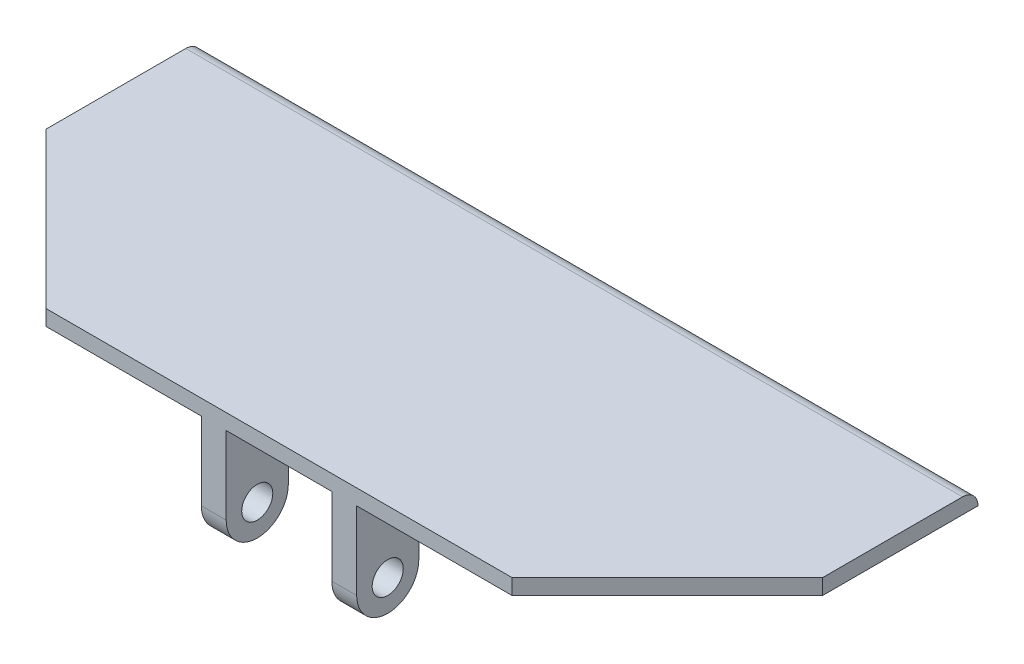
ISO-10303-21;
HEADER;
FILE_DESCRIPTION(('STEP AP214'),'2;1');
FILE_NAME('part.step','',(''),(''),'','','');
FILE_SCHEMA(('AUTOMOTIVE_DESIGN { 1 0 10303 214 1 1 1 1 }'));
ENDSEC;
DATA;
#1=APPLICATION_CONTEXT('core data for automotive mechanical design processes');
#2=APPLICATION_PROTOCOL_DEFINITION('international standard','automotive_design',2000,#1);
#3=PRODUCT_CONTEXT('',#1,'mechanical');
#4=PRODUCT('Part','Part','',(#3));
#5=PRODUCT_RELATED_PRODUCT_CATEGORY('part','',(#4));
#6=PRODUCT_DEFINITION_FORMATION('','',#4);
#7=PRODUCT_DEFINITION_CONTEXT('part definition',#1,'design');
#8=PRODUCT_DEFINITION('design','',#6,#7);
#9=PRODUCT_DEFINITION_SHAPE('','',#8);
#10=(LENGTH_UNIT() NAMED_UNIT(*) SI_UNIT(.MILLI.,.METRE.));
#11=(NAMED_UNIT(*) PLANE_ANGLE_UNIT() SI_UNIT($,.RADIAN.));
#12=(NAMED_UNIT(*) SI_UNIT($,.STERADIAN.) SOLID_ANGLE_UNIT());
#13=UNCERTAINTY_MEASURE_WITH_UNIT(LENGTH_MEASURE(1.E-05),#10,'distance_accuracy_value','');
#14=(GEOMETRIC_REPRESENTATION_CONTEXT(3) GLOBAL_UNCERTAINTY_ASSIGNED_CONTEXT((#13)) GLOBAL_UNIT_ASSIGNED_CONTEXT((#10,
#11,#12)) REPRESENTATION_CONTEXT('',''));
#15=CARTESIAN_POINT('',(0.,0.,0.));
#16=DIRECTION('',(0.,0.,1.));
#17=DIRECTION('',(1.,0.,0.));
#18=AXIS2_PLACEMENT_3D('',#15,#16,#17);
#19=CARTESIAN_POINT('',(0.,0.,0.));
#20=DIRECTION('',(0.,1.,0.));
#21=DIRECTION('',(0.,0.,1.));
#22=AXIS2_PLACEMENT_3D('',#19,#20,#21);
#23=PLANE('',#22);
#24=DIRECTION('',(0.,0.,-1.));
#25=VECTOR('',#24,1.);
#26=CARTESIAN_POINT('',(-150.,0.,0.));
#27=LINE('',#26,#25);
#28=CARTESIAN_POINT('',(-150.,0.,0.));
#29=VERTEX_POINT('',#28);
#30=CARTESIAN_POINT('',(-150.,0.,-20.));
#31=VERTEX_POINT('',#30);
#32=EDGE_CURVE('E189',#29,#31,#27,.T.);
#33=ORIENTED_EDGE('',*,*,#32,.F.);
#34=DIRECTION('',(1.,0.,0.));
#35=VECTOR('',#34,1.);
#36=CARTESIAN_POINT('',(0.,0.,0.));
#37=LINE('',#36,#35);
#38=CARTESIAN_POINT('',(-200.,0.,0.));
#39=VERTEX_POINT('',#38);
#40=EDGE_CURVE('E232',#39,#29,#37,.T.);
#41=ORIENTED_EDGE('',*,*,#40,.F.);
#42=DIRECTION('',(0.707106781186546,0.,0.707106781186549));
#43=VECTOR('',#42,1.);
#44=CARTESIAN_POINT('',(-200.,0.,0.));
#45=LINE('',#44,#43);
#46=CARTESIAN_POINT('',(-250.,0.,-50.0000000000002));
#47=VERTEX_POINT('',#46);
#48=EDGE_CURVE('E264',#39,#47,#45,.F.);
#49=ORIENTED_EDGE('',*,*,#48,.T.);
#50=DIRECTION('',(0.,0.,1.));
#51=VECTOR('',#50,1.);
#52=CARTESIAN_POINT('',(-250.,0.,0.));
#53=LINE('',#52,#51);
#54=CARTESIAN_POINT('',(-250.,0.,-100.));
#55=VERTEX_POINT('',#54);
#56=EDGE_CURVE('E246',#55,#47,#53,.T.);
#57=ORIENTED_EDGE('',*,*,#56,.F.);
#58=DIRECTION('',(-1.,0.,0.));
#59=VECTOR('',#58,1.);
#60=CARTESIAN_POINT('',(0.,0.,-100.));
#61=LINE('',#60,#59);
#62=CARTESIAN_POINT('',(0.,0.,-100.));
#63=VERTEX_POINT('',#62);
#64=EDGE_CURVE('E242',#63,#55,#61,.T.);
#65=ORIENTED_EDGE('',*,*,#64,.F.);
#66=DIRECTION('',(0.,0.,-1.));
#67=VECTOR('',#66,1.);
#68=CARTESIAN_POINT('',(0.,0.,0.));
#69=LINE('',#68,#67);
#70=CARTESIAN_POINT('',(0.,0.,-50.));
#71=VERTEX_POINT('',#70);
#72=EDGE_CURVE('E202',#71,#63,#69,.T.);
#73=ORIENTED_EDGE('',*,*,#72,.F.);
#74=DIRECTION('',(0.707106781186549,0.,-0.707106781186546));
#75=VECTOR('',#74,1.);
#76=CARTESIAN_POINT('',(0.,0.,-50.));
#77=LINE('',#76,#75);
#78=CARTESIAN_POINT('',(-50.0000000000001,0.,0.));
#79=VERTEX_POINT('',#78);
#80=EDGE_CURVE('E260',#71,#79,#77,.F.);
#81=ORIENTED_EDGE('',*,*,#80,.T.);
#82=CARTESIAN_POINT('',(-100.,0.,0.));
#83=VERTEX_POINT('',#82);
#84=EDGE_CURVE('E250',#83,#79,#37,.T.);
#85=ORIENTED_EDGE('',*,*,#84,.F.);
#86=DIRECTION('',(0.,0.,1.));
#87=VECTOR('',#86,1.);
#88=CARTESIAN_POINT('',(-100.,0.,0.));
#89=LINE('',#88,#87);
#90=CARTESIAN_POINT('',(-100.,0.,-20.));
#91=VERTEX_POINT('',#90);
#92=EDGE_CURVE('E216',#91,#83,#89,.T.);
#93=ORIENTED_EDGE('',*,*,#92,.F.);
#94=DIRECTION('',(1.,0.,0.));
#95=VECTOR('',#94,1.);
#96=CARTESIAN_POINT('',(-108.,0.,-20.));
#97=LINE('',#96,#95);
#98=CARTESIAN_POINT('',(-108.,0.,-20.));
#99=VERTEX_POINT('',#98);
#100=EDGE_CURVE('E220',#99,#91,#97,.T.);
#101=ORIENTED_EDGE('',*,*,#100,.F.);
#102=DIRECTION('',(0.,0.,-1.));
#103=VECTOR('',#102,1.);
#104=CARTESIAN_POINT('',(-108.,0.,0.));
#105=LINE('',#104,#103);
#106=CARTESIAN_POINT('',(-108.,0.,0.));
#107=VERTEX_POINT('',#106);
#108=EDGE_CURVE('E192',#107,#99,#105,.T.);
#109=ORIENTED_EDGE('',*,*,#108,.F.);
#110=CARTESIAN_POINT('',(-142.,0.,0.));
#111=VERTEX_POINT('',#110);
#112=EDGE_CURVE('E183',#111,#107,#37,.T.);
#113=ORIENTED_EDGE('',*,*,#112,.F.);
#114=DIRECTION('',(0.,0.,1.));
#115=VECTOR('',#114,1.);
#116=CARTESIAN_POINT('',(-142.,0.,0.));
#117=LINE('',#116,#115);
#118=CARTESIAN_POINT('',(-142.,0.,-20.));
#119=VERTEX_POINT('',#118);
#120=EDGE_CURVE('E164',#119,#111,#117,.T.);
#121=ORIENTED_EDGE('',*,*,#120,.F.);
#122=DIRECTION('',(1.,0.,0.));
#123=VECTOR('',#122,1.);
#124=CARTESIAN_POINT('',(-150.,0.,-20.));
#125=LINE('',#124,#123);
#126=EDGE_CURVE('E179',#31,#119,#125,.T.);
#127=ORIENTED_EDGE('',*,*,#126,.F.);
#128=EDGE_LOOP('',(#33,#41,#49,#57,#65,#73,#81,#85,#93,#101,#109,#113,#121,#127));
#129=FACE_BOUND('',#128,.T.);
#130=ADVANCED_FACE('F47',(#129),#23,.F.);
#131=CARTESIAN_POINT('',(0.,5.,0.));
#132=DIRECTION('',(-1.,0.,0.));
#133=DIRECTION('',(0.,0.,1.));
#134=AXIS2_PLACEMENT_3D('',#131,#132,#133);
#135=PLANE('',#134);
#136=ORIENTED_EDGE('',*,*,#72,.T.);
#137=CARTESIAN_POINT('',(0.,0.,-95.));
#138=DIRECTION('',(-1.,0.,0.));
#139=DIRECTION('',(0.,0.,1.));
#140=AXIS2_PLACEMENT_3D('',#137,#138,#139);
#141=CIRCLE('',#140,5.);
#142=CARTESIAN_POINT('',(0.,5.,-95.));
#143=VERTEX_POINT('',#142);
#144=EDGE_CURVE('E288',#63,#143,#141,.F.);
#145=ORIENTED_EDGE('',*,*,#144,.T.);
#146=DIRECTION('',(0.,0.,-1.));
#147=VECTOR('',#146,1.);
#148=CARTESIAN_POINT('',(0.,5.,0.));
#149=LINE('',#148,#147);
#150=CARTESIAN_POINT('',(0.,5.,-50.));
#151=VERTEX_POINT('',#150);
#152=EDGE_CURVE('E227',#151,#143,#149,.T.);
#153=ORIENTED_EDGE('',*,*,#152,.F.);
#154=DIRECTION('',(0.,-1.,0.));
#155=VECTOR('',#154,1.);
#156=CARTESIAN_POINT('',(0.,5.,-50.));
#157=LINE('',#156,#155);
#158=EDGE_CURVE('E277',#151,#71,#157,.T.);
#159=ORIENTED_EDGE('',*,*,#158,.T.);
#160=EDGE_LOOP('',(#136,#145,#153,#159));
#161=FACE_BOUND('',#160,.T.);
#162=ADVANCED_FACE('F369',(#161),#135,.F.);
#163=CARTESIAN_POINT('',(-250.,5.,0.));
#164=DIRECTION('',(1.,0.,0.));
#165=DIRECTION('',(0.,0.,-1.));
#166=AXIS2_PLACEMENT_3D('',#163,#164,#165);
#167=PLANE('',#166);
#168=DIRECTION('',(0.,0.,1.));
#169=VECTOR('',#168,1.);
#170=CARTESIAN_POINT('',(-250.,5.,0.));
#171=LINE('',#170,#169);
#172=CARTESIAN_POINT('',(-250.,5.,-95.));
#173=VERTEX_POINT('',#172);
#174=CARTESIAN_POINT('',(-250.,5.,-50.0000000000002));
#175=VERTEX_POINT('',#174);
#176=EDGE_CURVE('E231',#173,#175,#171,.T.);
#177=ORIENTED_EDGE('',*,*,#176,.F.);
#178=CARTESIAN_POINT('',(-250.,0.,-95.));
#179=DIRECTION('',(1.,0.,0.));
#180=DIRECTION('',(0.,0.,-1.));
#181=AXIS2_PLACEMENT_3D('',#178,#179,#180);
#182=CIRCLE('',#181,5.);
#183=EDGE_CURVE('E285',#173,#55,#182,.F.);
#184=ORIENTED_EDGE('',*,*,#183,.T.);
#185=ORIENTED_EDGE('',*,*,#56,.T.);
#186=DIRECTION('',(0.,1.,0.));
#187=VECTOR('',#186,1.);
#188=CARTESIAN_POINT('',(-250.,5.,-50.0000000000002));
#189=LINE('',#188,#187);
#190=EDGE_CURVE('E267',#47,#175,#189,.T.);
#191=ORIENTED_EDGE('',*,*,#190,.T.);
#192=EDGE_LOOP('',(#177,#184,#185,#191));
#193=FACE_BOUND('',#192,.T.);
#194=ADVANCED_FACE('F354',(#193),#167,.F.);
#195=CARTESIAN_POINT('',(0.,5.,0.));
#196=DIRECTION('',(0.,0.,-1.));
#197=DIRECTION('',(-1.,0.,0.));
#198=AXIS2_PLACEMENT_3D('',#195,#196,#197);
#199=PLANE('',#198);
#200=DIRECTION('',(0.,1.,0.));
#201=VECTOR('',#200,1.);
#202=CARTESIAN_POINT('',(-150.,-35.,0.));
#203=LINE('',#202,#201);
#204=CARTESIAN_POINT('',(-150.,-25.,0.));
#205=VERTEX_POINT('',#204);
#206=EDGE_CURVE('E185',#205,#29,#203,.T.);
#207=ORIENTED_EDGE('',*,*,#206,.F.);
#208=DIRECTION('',(-1.,0.,0.));
#209=VECTOR('',#208,1.);
#210=CARTESIAN_POINT('',(-142.,-25.,0.));
#211=LINE('',#210,#209);
#212=CARTESIAN_POINT('',(-142.,-25.,0.));
#213=VERTEX_POINT('',#212);
#214=EDGE_CURVE('E11',#205,#213,#211,.F.);
#215=ORIENTED_EDGE('',*,*,#214,.T.);
#216=DIRECTION('',(0.,1.,0.));
#217=VECTOR('',#216,1.);
#218=CARTESIAN_POINT('',(-142.,-35.,0.));
#219=LINE('',#218,#217);
#220=EDGE_CURVE('E173',#213,#111,#219,.T.);
#221=ORIENTED_EDGE('',*,*,#220,.T.);
#222=ORIENTED_EDGE('',*,*,#112,.T.);
#223=DIRECTION('',(0.,1.,0.));
#224=VECTOR('',#223,1.);
#225=CARTESIAN_POINT('',(-108.,-35.,0.));
#226=LINE('',#225,#224);
#227=CARTESIAN_POINT('',(-108.,-25.,0.));
#228=VERTEX_POINT('',#227);
#229=EDGE_CURVE('E213',#228,#107,#226,.T.);
#230=ORIENTED_EDGE('',*,*,#229,.F.);
#231=DIRECTION('',(-1.,0.,0.));
#232=VECTOR('',#231,1.);
#233=CARTESIAN_POINT('',(-100.,-25.,0.));
#234=LINE('',#233,#232);
#235=CARTESIAN_POINT('',(-100.,-25.,0.));
#236=VERTEX_POINT('',#235);
#237=EDGE_CURVE('E57',#228,#236,#234,.F.);
#238=ORIENTED_EDGE('',*,*,#237,.T.);
#239=DIRECTION('',(0.,1.,0.));
#240=VECTOR('',#239,1.);
#241=CARTESIAN_POINT('',(-100.,-35.,0.));
#242=LINE('',#241,#240);
#243=EDGE_CURVE('E210',#236,#83,#242,.T.);
#244=ORIENTED_EDGE('',*,*,#243,.T.);
#245=ORIENTED_EDGE('',*,*,#84,.T.);
#246=DIRECTION('',(0.,1.,0.));
#247=VECTOR('',#246,1.);
#248=CARTESIAN_POINT('',(-50.0000000000001,5.,0.));
#249=LINE('',#248,#247);
#250=CARTESIAN_POINT('',(-50.0000000000001,5.,0.));
#251=VERTEX_POINT('',#250);
#252=EDGE_CURVE('E239',#79,#251,#249,.T.);
#253=ORIENTED_EDGE('',*,*,#252,.T.);
#254=DIRECTION('',(1.,0.,0.));
#255=VECTOR('',#254,1.);
#256=CARTESIAN_POINT('',(0.,5.,0.));
#257=LINE('',#256,#255);
#258=CARTESIAN_POINT('',(-200.,5.,0.));
#259=VERTEX_POINT('',#258);
#260=EDGE_CURVE('E235',#259,#251,#257,.T.);
#261=ORIENTED_EDGE('',*,*,#260,.F.);
#262=DIRECTION('',(0.,-1.,0.));
#263=VECTOR('',#262,1.);
#264=CARTESIAN_POINT('',(-200.,5.,0.));
#265=LINE('',#264,#263);
#266=EDGE_CURVE('E256',#259,#39,#265,.T.);
#267=ORIENTED_EDGE('',*,*,#266,.T.);
#268=ORIENTED_EDGE('',*,*,#40,.T.);
#269=EDGE_LOOP('',(#207,#215,#221,#222,#230,#238,#244,#245,#253,#261,#267,#268));
#270=FACE_BOUND('',#269,.T.);
#271=ADVANCED_FACE('F344',(#270),#199,.F.);
#272=CARTESIAN_POINT('',(0.,5.,0.));
#273=DIRECTION('',(0.,1.,0.));
#274=DIRECTION('',(0.,0.,1.));
#275=AXIS2_PLACEMENT_3D('',#272,#273,#274);
#276=PLANE('',#275);
#277=ORIENTED_EDGE('',*,*,#152,.T.);
#278=DIRECTION('',(-1.,0.,0.));
#279=VECTOR('',#278,1.);
#280=CARTESIAN_POINT('',(-250.,5.,-95.));
#281=LINE('',#280,#279);
#282=EDGE_CURVE('E281',#143,#173,#281,.T.);
#283=ORIENTED_EDGE('',*,*,#282,.T.);
#284=ORIENTED_EDGE('',*,*,#176,.T.);
#285=DIRECTION('',(-0.707106781186546,0.,-0.707106781186549));
#286=VECTOR('',#285,1.);
#287=CARTESIAN_POINT('',(-100.,5.,100.));
#288=LINE('',#287,#286);
#289=EDGE_CURVE('E274',#175,#259,#288,.F.);
#290=ORIENTED_EDGE('',*,*,#289,.T.);
#291=ORIENTED_EDGE('',*,*,#260,.T.);
#292=DIRECTION('',(-0.707106781186549,0.,0.707106781186546));
#293=VECTOR('',#292,1.);
#294=CARTESIAN_POINT('',(-25.,5.,-25.0000000000001));
#295=LINE('',#294,#293);
#296=EDGE_CURVE('E271',#251,#151,#295,.F.);
#297=ORIENTED_EDGE('',*,*,#296,.T.);
#298=EDGE_LOOP('',(#277,#283,#284,#290,#291,#297));
#299=FACE_BOUND('',#298,.T.);
#300=ADVANCED_FACE('F359',(#299),#276,.T.);
#301=CARTESIAN_POINT('',(-200.,5.,0.));
#302=DIRECTION('',(0.707106781186549,0.,-0.707106781186546));
#303=DIRECTION('',(0.,-1.,0.));
#304=AXIS2_PLACEMENT_3D('',#301,#302,#303);
#305=PLANE('',#304);
#306=ORIENTED_EDGE('',*,*,#289,.F.);
#307=ORIENTED_EDGE('',*,*,#190,.F.);
#308=ORIENTED_EDGE('',*,*,#48,.F.);
#309=ORIENTED_EDGE('',*,*,#266,.F.);
#310=EDGE_LOOP('',(#306,#307,#308,#309));
#311=FACE_BOUND('',#310,.T.);
#312=ADVANCED_FACE('F356',(#311),#305,.F.);
#313=CARTESIAN_POINT('',(0.,5.,-50.));
#314=DIRECTION('',(-0.707106781186546,0.,-0.707106781186549));
#315=DIRECTION('',(0.,-1.,0.));
#316=AXIS2_PLACEMENT_3D('',#313,#314,#315);
#317=PLANE('',#316);
#318=ORIENTED_EDGE('',*,*,#296,.F.);
#319=ORIENTED_EDGE('',*,*,#252,.F.);
#320=ORIENTED_EDGE('',*,*,#80,.F.);
#321=ORIENTED_EDGE('',*,*,#158,.F.);
#322=EDGE_LOOP('',(#318,#319,#320,#321));
#323=FACE_BOUND('',#322,.T.);
#324=ADVANCED_FACE('F364',(#323),#317,.F.);
#325=CARTESIAN_POINT('',(0.,0.,-95.));
#326=DIRECTION('',(1.,0.,0.));
#327=DIRECTION('',(0.,0.,-1.));
#328=AXIS2_PLACEMENT_3D('',#325,#326,#327);
#329=CYLINDRICAL_SURFACE('',#328,5.);
#330=ORIENTED_EDGE('',*,*,#144,.F.);
#331=ORIENTED_EDGE('',*,*,#64,.T.);
#332=ORIENTED_EDGE('',*,*,#183,.F.);
#333=ORIENTED_EDGE('',*,*,#282,.F.);
#334=EDGE_LOOP('',(#330,#331,#332,#333));
#335=FACE_BOUND('',#334,.T.);
#336=ADVANCED_FACE('F373',(#335),#329,.T.);
#337=CARTESIAN_POINT('',(-108.,-35.,0.));
#338=DIRECTION('',(1.,0.,0.));
#339=DIRECTION('',(0.,0.,-1.));
#340=AXIS2_PLACEMENT_3D('',#337,#338,#339);
#341=PLANE('',#340);
#342=CARTESIAN_POINT('',(-108.,-25.,-10.));
#343=DIRECTION('',(1.,0.,0.));
#344=DIRECTION('',(0.,0.,-1.));
#345=AXIS2_PLACEMENT_3D('',#342,#343,#344);
#346=CIRCLE('',#345,5.);
#347=CARTESIAN_POINT('',(-108.,-25.,-15.));
#348=VERTEX_POINT('',#347);
#349=EDGE_CURVE('E207',#348,#348,#346,.T.);
#350=ORIENTED_EDGE('',*,*,#349,.T.);
#351=EDGE_LOOP('',(#350));
#352=FACE_BOUND('',#351,.T.);
#353=DIRECTION('',(0.,1.,0.));
#354=VECTOR('',#353,1.);
#355=CARTESIAN_POINT('',(-108.,-35.,-20.));
#356=LINE('',#355,#354);
#357=CARTESIAN_POINT('',(-108.,-25.,-20.));
#358=VERTEX_POINT('',#357);
#359=EDGE_CURVE('E203',#358,#99,#356,.T.);
#360=ORIENTED_EDGE('',*,*,#359,.F.);
#361=CARTESIAN_POINT('',(-108.,-25.,-10.));
#362=DIRECTION('',(1.,0.,0.));
#363=DIRECTION('',(0.,0.,-1.));
#364=AXIS2_PLACEMENT_3D('',#361,#362,#363);
#365=CIRCLE('',#364,10.);
#366=CARTESIAN_POINT('',(-108.,-35.,-10.));
#367=VERTEX_POINT('',#366);
#368=EDGE_CURVE('E310',#358,#367,#365,.F.);
#369=ORIENTED_EDGE('',*,*,#368,.T.);
#370=CARTESIAN_POINT('',(-108.,-25.,-10.));
#371=DIRECTION('',(1.,0.,0.));
#372=DIRECTION('',(0.,0.,-1.));
#373=AXIS2_PLACEMENT_3D('',#370,#371,#372);
#374=CIRCLE('',#373,10.);
#375=EDGE_CURVE('E307',#367,#228,#374,.F.);
#376=ORIENTED_EDGE('',*,*,#375,.T.);
#377=ORIENTED_EDGE('',*,*,#229,.T.);
#378=ORIENTED_EDGE('',*,*,#108,.T.);
#379=EDGE_LOOP('',(#360,#369,#376,#377,#378));
#380=FACE_BOUND('',#379,.T.);
#381=ADVANCED_FACE('F389',(#352,#380),#341,.F.);
#382=CARTESIAN_POINT('',(-108.,-35.,-20.));
#383=DIRECTION('',(0.,0.,1.));
#384=DIRECTION('',(1.,0.,0.));
#385=AXIS2_PLACEMENT_3D('',#382,#383,#384);
#386=PLANE('',#385);
#387=DIRECTION('',(0.,1.,0.));
#388=VECTOR('',#387,1.);
#389=CARTESIAN_POINT('',(-100.,-35.,-20.));
#390=LINE('',#389,#388);
#391=CARTESIAN_POINT('',(-100.,-25.,-20.));
#392=VERTEX_POINT('',#391);
#393=EDGE_CURVE('E206',#392,#91,#390,.T.);
#394=ORIENTED_EDGE('',*,*,#393,.F.);
#395=DIRECTION('',(1.,0.,0.));
#396=VECTOR('',#395,1.);
#397=CARTESIAN_POINT('',(-108.,-25.,-20.));
#398=LINE('',#397,#396);
#399=EDGE_CURVE('E303',#392,#358,#398,.F.);
#400=ORIENTED_EDGE('',*,*,#399,.T.);
#401=ORIENTED_EDGE('',*,*,#359,.T.);
#402=ORIENTED_EDGE('',*,*,#100,.T.);
#403=EDGE_LOOP('',(#394,#400,#401,#402));
#404=FACE_BOUND('',#403,.T.);
#405=ADVANCED_FACE('F384',(#404),#386,.F.);
#406=CARTESIAN_POINT('',(-100.,-35.,0.));
#407=DIRECTION('',(-1.,0.,0.));
#408=DIRECTION('',(0.,0.,1.));
#409=AXIS2_PLACEMENT_3D('',#406,#407,#408);
#410=PLANE('',#409);
#411=CARTESIAN_POINT('',(-100.,-25.,-10.));
#412=DIRECTION('',(1.,0.,0.));
#413=DIRECTION('',(0.,0.,-1.));
#414=AXIS2_PLACEMENT_3D('',#411,#412,#413);
#415=CIRCLE('',#414,5.);
#416=CARTESIAN_POINT('',(-100.,-25.,-15.));
#417=VERTEX_POINT('',#416);
#418=EDGE_CURVE('E297',#417,#417,#415,.T.);
#419=ORIENTED_EDGE('',*,*,#418,.F.);
#420=EDGE_LOOP('',(#419));
#421=FACE_BOUND('',#420,.T.);
#422=CARTESIAN_POINT('',(-100.,-25.,-10.));
#423=DIRECTION('',(-1.,0.,0.));
#424=DIRECTION('',(0.,0.,1.));
#425=AXIS2_PLACEMENT_3D('',#422,#423,#424);
#426=CIRCLE('',#425,10.);
#427=CARTESIAN_POINT('',(-100.,-35.,-10.));
#428=VERTEX_POINT('',#427);
#429=EDGE_CURVE('E291',#236,#428,#426,.F.);
#430=ORIENTED_EDGE('',*,*,#429,.T.);
#431=CARTESIAN_POINT('',(-100.,-25.,-10.));
#432=DIRECTION('',(-1.,0.,0.));
#433=DIRECTION('',(0.,0.,1.));
#434=AXIS2_PLACEMENT_3D('',#431,#432,#433);
#435=CIRCLE('',#434,10.);
#436=EDGE_CURVE('E300',#428,#392,#435,.F.);
#437=ORIENTED_EDGE('',*,*,#436,.T.);
#438=ORIENTED_EDGE('',*,*,#393,.T.);
#439=ORIENTED_EDGE('',*,*,#92,.T.);
#440=ORIENTED_EDGE('',*,*,#243,.F.);
#441=EDGE_LOOP('',(#430,#437,#438,#439,#440));
#442=FACE_BOUND('',#441,.T.);
#443=ADVANCED_FACE('F379',(#421,#442),#410,.F.);
#444=CARTESIAN_POINT('',(-150.,-35.,0.));
#445=DIRECTION('',(1.,0.,0.));
#446=DIRECTION('',(0.,0.,-1.));
#447=AXIS2_PLACEMENT_3D('',#444,#445,#446);
#448=PLANE('',#447);
#449=CARTESIAN_POINT('',(-150.,-25.,-10.));
#450=DIRECTION('',(1.,0.,0.));
#451=DIRECTION('',(0.,0.,-1.));
#452=AXIS2_PLACEMENT_3D('',#449,#450,#451);
#453=CIRCLE('',#452,5.);
#454=CARTESIAN_POINT('',(-150.,-25.,-15.));
#455=VERTEX_POINT('',#454);
#456=EDGE_CURVE('E296',#455,#455,#453,.T.);
#457=ORIENTED_EDGE('',*,*,#456,.T.);
#458=EDGE_LOOP('',(#457));
#459=FACE_BOUND('',#458,.T.);
#460=DIRECTION('',(0.,1.,0.));
#461=VECTOR('',#460,1.);
#462=CARTESIAN_POINT('',(-150.,-35.,-20.));
#463=LINE('',#462,#461);
#464=CARTESIAN_POINT('',(-150.,-25.,-20.));
#465=VERTEX_POINT('',#464);
#466=EDGE_CURVE('E172',#465,#31,#463,.T.);
#467=ORIENTED_EDGE('',*,*,#466,.F.);
#468=CARTESIAN_POINT('',(-150.,-25.,-10.));
#469=DIRECTION('',(1.,0.,0.));
#470=DIRECTION('',(0.,0.,-1.));
#471=AXIS2_PLACEMENT_3D('',#468,#469,#470);
#472=CIRCLE('',#471,10.);
#473=CARTESIAN_POINT('',(-150.,-35.,-10.));
#474=VERTEX_POINT('',#473);
#475=EDGE_CURVE('E70',#465,#474,#472,.F.);
#476=ORIENTED_EDGE('',*,*,#475,.T.);
#477=CARTESIAN_POINT('',(-150.,-25.,-10.));
#478=DIRECTION('',(1.,0.,0.));
#479=DIRECTION('',(0.,0.,-1.));
#480=AXIS2_PLACEMENT_3D('',#477,#478,#479);
#481=CIRCLE('',#480,10.);
#482=EDGE_CURVE('E65',#474,#205,#481,.F.);
#483=ORIENTED_EDGE('',*,*,#482,.T.);
#484=ORIENTED_EDGE('',*,*,#206,.T.);
#485=ORIENTED_EDGE('',*,*,#32,.T.);
#486=EDGE_LOOP('',(#467,#476,#483,#484,#485));
#487=FACE_BOUND('',#486,.T.);
#488=ADVANCED_FACE('F346',(#459,#487),#448,.F.);
#489=CARTESIAN_POINT('',(-150.,-35.,-20.));
#490=DIRECTION('',(0.,0.,1.));
#491=DIRECTION('',(1.,0.,0.));
#492=AXIS2_PLACEMENT_3D('',#489,#490,#491);
#493=PLANE('',#492);
#494=DIRECTION('',(0.,1.,0.));
#495=VECTOR('',#494,1.);
#496=CARTESIAN_POINT('',(-142.,-35.,-20.));
#497=LINE('',#496,#495);
#498=CARTESIAN_POINT('',(-142.,-25.,-20.));
#499=VERTEX_POINT('',#498);
#500=EDGE_CURVE('E160',#499,#119,#497,.T.);
#501=ORIENTED_EDGE('',*,*,#500,.F.);
#502=DIRECTION('',(1.,0.,0.));
#503=VECTOR('',#502,1.);
#504=CARTESIAN_POINT('',(-150.,-25.,-20.));
#505=LINE('',#504,#503);
#506=EDGE_CURVE('E318',#499,#465,#505,.F.);
#507=ORIENTED_EDGE('',*,*,#506,.T.);
#508=ORIENTED_EDGE('',*,*,#466,.T.);
#509=ORIENTED_EDGE('',*,*,#126,.T.);
#510=EDGE_LOOP('',(#501,#507,#508,#509));
#511=FACE_BOUND('',#510,.T.);
#512=ADVANCED_FACE('F187',(#511),#493,.F.);
#513=CARTESIAN_POINT('',(-142.,-35.,0.));
#514=DIRECTION('',(-1.,0.,0.));
#515=DIRECTION('',(0.,0.,1.));
#516=AXIS2_PLACEMENT_3D('',#513,#514,#515);
#517=PLANE('',#516);
#518=CARTESIAN_POINT('',(-142.,-25.,-10.));
#519=DIRECTION('',(-1.,0.,0.));
#520=DIRECTION('',(0.,0.,1.));
#521=AXIS2_PLACEMENT_3D('',#518,#519,#520);
#522=CIRCLE('',#521,5.);
#523=CARTESIAN_POINT('',(-142.,-25.,-5.));
#524=VERTEX_POINT('',#523);
#525=EDGE_CURVE('E292',#524,#524,#522,.T.);
#526=ORIENTED_EDGE('',*,*,#525,.T.);
#527=EDGE_LOOP('',(#526));
#528=FACE_BOUND('',#527,.T.);
#529=CARTESIAN_POINT('',(-142.,-25.,-10.));
#530=DIRECTION('',(-1.,0.,0.));
#531=DIRECTION('',(0.,0.,1.));
#532=AXIS2_PLACEMENT_3D('',#529,#530,#531);
#533=CIRCLE('',#532,10.);
#534=CARTESIAN_POINT('',(-142.,-35.,-10.));
#535=VERTEX_POINT('',#534);
#536=EDGE_CURVE('E313',#213,#535,#533,.F.);
#537=ORIENTED_EDGE('',*,*,#536,.T.);
#538=CARTESIAN_POINT('',(-142.,-25.,-10.));
#539=DIRECTION('',(-1.,0.,0.));
#540=DIRECTION('',(0.,0.,1.));
#541=AXIS2_PLACEMENT_3D('',#538,#539,#540);
#542=CIRCLE('',#541,10.);
#543=EDGE_CURVE('E166',#535,#499,#542,.F.);
#544=ORIENTED_EDGE('',*,*,#543,.T.);
#545=ORIENTED_EDGE('',*,*,#500,.T.);
#546=ORIENTED_EDGE('',*,*,#120,.T.);
#547=ORIENTED_EDGE('',*,*,#220,.F.);
#548=EDGE_LOOP('',(#537,#544,#545,#546,#547));
#549=FACE_BOUND('',#548,.T.);
#550=ADVANCED_FACE('F162',(#528,#549),#517,.F.);
#551=CARTESIAN_POINT('',(-250.,-25.,-10.));
#552=DIRECTION('',(1.,0.,0.));
#553=DIRECTION('',(0.,0.,-1.));
#554=AXIS2_PLACEMENT_3D('',#551,#552,#553);
#555=CYLINDRICAL_SURFACE('',#554,5.);
#556=ORIENTED_EDGE('',*,*,#525,.F.);
#557=EDGE_LOOP('',(#556));
#558=FACE_BOUND('',#557,.T.);
#559=ORIENTED_EDGE('',*,*,#456,.F.);
#560=EDGE_LOOP('',(#559));
#561=FACE_BOUND('',#560,.T.);
#562=ADVANCED_FACE('F404',(#558,#561),#555,.F.);
#563=ORIENTED_EDGE('',*,*,#418,.T.);
#564=EDGE_LOOP('',(#563));
#565=FACE_BOUND('',#564,.T.);
#566=ORIENTED_EDGE('',*,*,#349,.F.);
#567=EDGE_LOOP('',(#566));
#568=FACE_BOUND('',#567,.T.);
#569=ADVANCED_FACE('F396',(#565,#568),#555,.F.);
#570=CARTESIAN_POINT('',(0.,-25.,-10.));
#571=DIRECTION('',(1.,0.,0.));
#572=DIRECTION('',(0.,0.,-1.));
#573=AXIS2_PLACEMENT_3D('',#570,#571,#572);
#574=CYLINDRICAL_SURFACE('',#573,10.);
#575=ORIENTED_EDGE('',*,*,#237,.F.);
#576=ORIENTED_EDGE('',*,*,#375,.F.);
#577=DIRECTION('',(-1.,0.,0.));
#578=VECTOR('',#577,1.);
#579=CARTESIAN_POINT('',(-108.,-35.,-10.));
#580=LINE('',#579,#578);
#581=EDGE_CURVE('E326',#428,#367,#580,.T.);
#582=ORIENTED_EDGE('',*,*,#581,.F.);
#583=ORIENTED_EDGE('',*,*,#429,.F.);
#584=EDGE_LOOP('',(#575,#576,#582,#583));
#585=FACE_BOUND('',#584,.T.);
#586=ADVANCED_FACE('F393',(#585),#574,.T.);
#587=CARTESIAN_POINT('',(0.,-25.,-10.));
#588=DIRECTION('',(-1.,0.,0.));
#589=DIRECTION('',(0.,0.,1.));
#590=AXIS2_PLACEMENT_3D('',#587,#588,#589);
#591=CYLINDRICAL_SURFACE('',#590,10.);
#592=ORIENTED_EDGE('',*,*,#368,.F.);
#593=ORIENTED_EDGE('',*,*,#399,.F.);
#594=ORIENTED_EDGE('',*,*,#436,.F.);
#595=ORIENTED_EDGE('',*,*,#581,.T.);
#596=EDGE_LOOP('',(#592,#593,#594,#595));
#597=FACE_BOUND('',#596,.T.);
#598=ADVANCED_FACE('F386',(#597),#591,.T.);
#599=CARTESIAN_POINT('',(0.,-25.,-10.));
#600=DIRECTION('',(1.,0.,0.));
#601=DIRECTION('',(0.,0.,-1.));
#602=AXIS2_PLACEMENT_3D('',#599,#600,#601);
#603=CYLINDRICAL_SURFACE('',#602,10.);
#604=ORIENTED_EDGE('',*,*,#214,.F.);
#605=ORIENTED_EDGE('',*,*,#482,.F.);
#606=DIRECTION('',(-1.,0.,0.));
#607=VECTOR('',#606,1.);
#608=CARTESIAN_POINT('',(-150.,-35.,-10.));
#609=LINE('',#608,#607);
#610=EDGE_CURVE('E51',#535,#474,#609,.T.);
#611=ORIENTED_EDGE('',*,*,#610,.F.);
#612=ORIENTED_EDGE('',*,*,#536,.F.);
#613=EDGE_LOOP('',(#604,#605,#611,#612));
#614=FACE_BOUND('',#613,.T.);
#615=ADVANCED_FACE('F49',(#614),#603,.T.);
#616=CARTESIAN_POINT('',(0.,-25.,-9.99999999999994));
#617=DIRECTION('',(-1.,0.,0.));
#618=DIRECTION('',(0.,0.,1.));
#619=AXIS2_PLACEMENT_3D('',#616,#617,#618);
#620=CYLINDRICAL_SURFACE('',#619,10.);
#621=ORIENTED_EDGE('',*,*,#475,.F.);
#622=ORIENTED_EDGE('',*,*,#506,.F.);
#623=ORIENTED_EDGE('',*,*,#543,.F.);
#624=ORIENTED_EDGE('',*,*,#610,.T.);
#625=EDGE_LOOP('',(#621,#622,#623,#624));
#626=FACE_BOUND('',#625,.T.);
#627=ADVANCED_FACE('F339',(#626),#620,.T.);
#628=CLOSED_SHELL('',(#130,#162,#194,#271,#300,#312,#324,#336,#381,#405,#443,#488,#512,#550,
#562,#569,#586,#598,#615,#627));
#629=MANIFOLD_SOLID_BREP('B2',#628);
#630=ADVANCED_BREP_SHAPE_REPRESENTATION('',(#18,#629),#14);
#631=SHAPE_DEFINITION_REPRESENTATION(#9,#630);
ENDSEC;
END-ISO-10303-21;
